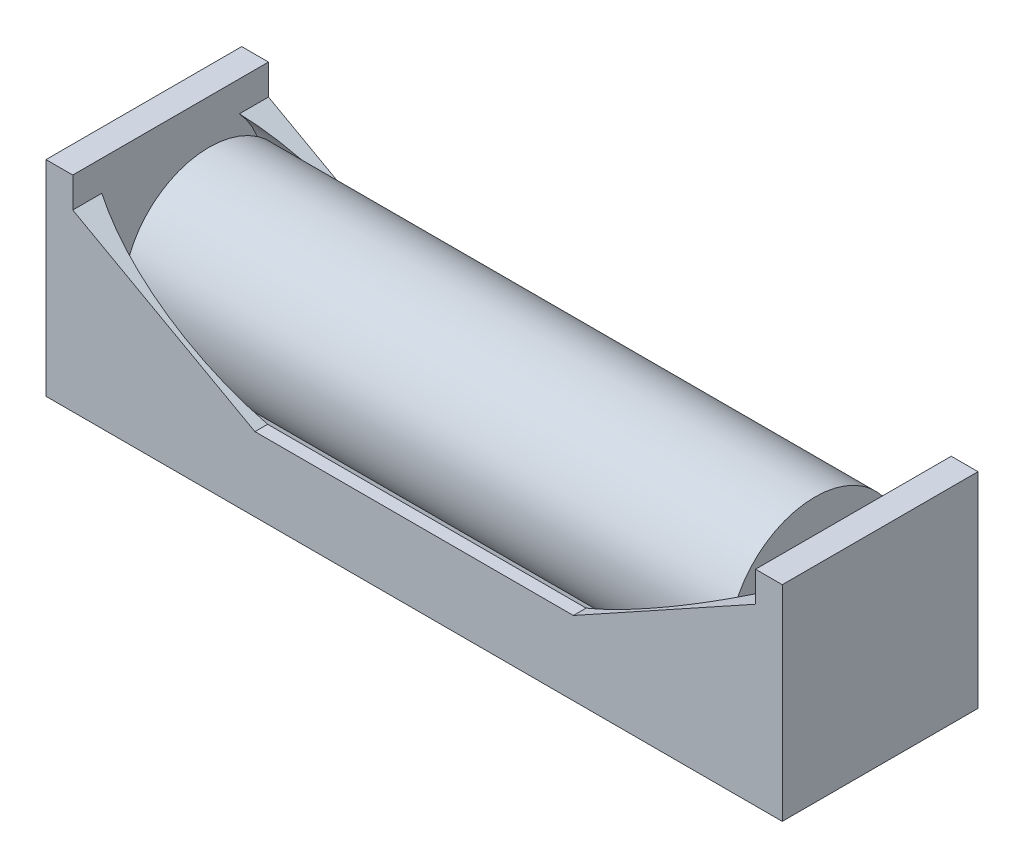
ISO-10303-21;
HEADER;
FILE_DESCRIPTION(('STEP AP214'),'2;1');
FILE_NAME('part.step','',(''),(''),'','','');
FILE_SCHEMA(('AUTOMOTIVE_DESIGN { 1 0 10303 214 1 1 1 1 }'));
ENDSEC;
DATA;
#1=APPLICATION_CONTEXT('core data for automotive mechanical design processes');
#2=APPLICATION_PROTOCOL_DEFINITION('international standard','automotive_design',2000,#1);
#3=PRODUCT_CONTEXT('',#1,'mechanical');
#4=PRODUCT('Part','Part','',(#3));
#5=PRODUCT_RELATED_PRODUCT_CATEGORY('part','',(#4));
#6=PRODUCT_DEFINITION_FORMATION('','',#4);
#7=PRODUCT_DEFINITION_CONTEXT('part definition',#1,'design');
#8=PRODUCT_DEFINITION('design','',#6,#7);
#9=PRODUCT_DEFINITION_SHAPE('','',#8);
#10=(LENGTH_UNIT() NAMED_UNIT(*) SI_UNIT(.MILLI.,.METRE.));
#11=(NAMED_UNIT(*) PLANE_ANGLE_UNIT() SI_UNIT($,.RADIAN.));
#12=(NAMED_UNIT(*) SI_UNIT($,.STERADIAN.) SOLID_ANGLE_UNIT());
#13=UNCERTAINTY_MEASURE_WITH_UNIT(LENGTH_MEASURE(1.E-05),#10,'distance_accuracy_value','');
#14=(GEOMETRIC_REPRESENTATION_CONTEXT(3) GLOBAL_UNCERTAINTY_ASSIGNED_CONTEXT((#13)) GLOBAL_UNIT_ASSIGNED_CONTEXT((#10,
#11,#12)) REPRESENTATION_CONTEXT('',''));
#15=CARTESIAN_POINT('',(0.,0.,0.));
#16=DIRECTION('',(0.,0.,1.));
#17=DIRECTION('',(1.,0.,0.));
#18=AXIS2_PLACEMENT_3D('',#15,#16,#17);
#19=CARTESIAN_POINT('',(-17.083580508812,4.9297339274579,-10.5));
#20=DIRECTION('',(3.17830590431947E-13,-1.,0.));
#21=DIRECTION('',(1.,3.17830590431947E-13,0.));
#22=AXIS2_PLACEMENT_3D('',#19,#20,#21);
#23=PLANE('',#22);
#24=DIRECTION('',(-1.,0.,0.));
#25=VECTOR('',#24,1.);
#26=CARTESIAN_POINT('',(64.913258277274,4.92973392748396,9.13416302125843));
#27=LINE('',#26,#25);
#28=CARTESIAN_POINT('',(-17.083580508812,4.92973392748396,9.13416302125843));
#29=VERTEX_POINT('',#28);
#30=CARTESIAN_POINT('',(17.083580508812,4.9297339274579,9.13416302124681));
#31=VERTEX_POINT('',#30);
#32=EDGE_CURVE('E148',#29,#31,#27,.F.);
#33=ORIENTED_EDGE('',*,*,#32,.F.);
#34=DIRECTION('',(0.,0.,1.));
#35=VECTOR('',#34,1.);
#36=CARTESIAN_POINT('',(-17.083580508812,4.9297339274579,-10.5));
#37=LINE('',#36,#35);
#38=CARTESIAN_POINT('',(-17.083580508812,4.9297339274579,10.5));
#39=VERTEX_POINT('',#38);
#40=EDGE_CURVE('E192',#29,#39,#37,.T.);
#41=ORIENTED_EDGE('',*,*,#40,.T.);
#42=DIRECTION('',(1.,3.17830590431947E-13,0.));
#43=VECTOR('',#42,1.);
#44=CARTESIAN_POINT('',(-17.083580508812,4.9297339274579,10.5));
#45=LINE('',#44,#43);
#46=CARTESIAN_POINT('',(17.083580508812,4.9297339274579,10.5));
#47=VERTEX_POINT('',#46);
#48=EDGE_CURVE('E175',#39,#47,#45,.T.);
#49=ORIENTED_EDGE('',*,*,#48,.T.);
#50=DIRECTION('',(0.,0.,1.));
#51=VECTOR('',#50,1.);
#52=CARTESIAN_POINT('',(17.083580508812,4.9297339274579,-10.5));
#53=LINE('',#52,#51);
#54=EDGE_CURVE('E172',#31,#47,#53,.T.);
#55=ORIENTED_EDGE('',*,*,#54,.F.);
#56=EDGE_LOOP('',(#33,#41,#49,#55));
#57=FACE_BOUND('',#56,.T.);
#58=ADVANCED_FACE('F45',(#57),#23,.F.);
#59=DIRECTION('',(-1.,0.,0.));
#60=VECTOR('',#59,1.);
#61=CARTESIAN_POINT('',(64.913258277274,4.92973392748396,-9.13416302125843));
#62=LINE('',#61,#60);
#63=CARTESIAN_POINT('',(17.083580508812,4.9297339274579,-9.13416302124683));
#64=VERTEX_POINT('',#63);
#65=CARTESIAN_POINT('',(-17.083580508812,4.92973392748396,-9.13416302125843));
#66=VERTEX_POINT('',#65);
#67=EDGE_CURVE('E279',#64,#66,#62,.T.);
#68=ORIENTED_EDGE('',*,*,#67,.F.);
#69=CARTESIAN_POINT('',(17.083580508812,4.9297339274579,-10.5));
#70=VERTEX_POINT('',#69);
#71=EDGE_CURVE('E159',#70,#64,#53,.T.);
#72=ORIENTED_EDGE('',*,*,#71,.F.);
#73=DIRECTION('',(1.,3.17830590431947E-13,0.));
#74=VECTOR('',#73,1.);
#75=CARTESIAN_POINT('',(-17.083580508812,4.9297339274579,-10.5));
#76=LINE('',#75,#74);
#77=CARTESIAN_POINT('',(-17.083580508812,4.9297339274579,-10.5));
#78=VERTEX_POINT('',#77);
#79=EDGE_CURVE('E178',#78,#70,#76,.T.);
#80=ORIENTED_EDGE('',*,*,#79,.F.);
#81=EDGE_CURVE('E188',#78,#66,#37,.T.);
#82=ORIENTED_EDGE('',*,*,#81,.T.);
#83=EDGE_LOOP('',(#68,#72,#80,#82));
#84=FACE_BOUND('',#83,.T.);
#85=ADVANCED_FACE('F278',(#84),#23,.F.);
#86=CARTESIAN_POINT('',(-36.6289870298108,15.7468482234305,-10.5));
#87=DIRECTION('',(-0.484224588764029,-0.874943739697763,0.));
#88=DIRECTION('',(0.874943739697763,-0.484224588764029,0.));
#89=AXIS2_PLACEMENT_3D('',#86,#87,#88);
#90=PLANE('',#89);
#91=CARTESIAN_POINT('',(-24.4381302398881,9.,0.));
#92=DIRECTION('',(-0.484224588764029,-0.874943739697763,0.));
#93=DIRECTION('',(-0.874943739697763,0.484224588764029,0.));
#94=AXIS2_PLACEMENT_3D('',#91,#92,#93);
#95=ELLIPSE('',#94,20.6515741497654,10.);
#96=CARTESIAN_POINT('',(-36.6289870298108,15.7468482234305,7.38105948018252));
#97=VERTEX_POINT('',#96);
#98=EDGE_CURVE('E280',#97,#29,#95,.F.);
#99=ORIENTED_EDGE('',*,*,#98,.F.);
#100=DIRECTION('',(0.,0.,1.));
#101=VECTOR('',#100,1.);
#102=CARTESIAN_POINT('',(-36.6289870298108,15.7468482234305,-10.5));
#103=LINE('',#102,#101);
#104=CARTESIAN_POINT('',(-36.6289870298108,15.7468482234305,10.5));
#105=VERTEX_POINT('',#104);
#106=EDGE_CURVE('E196',#97,#105,#103,.T.);
#107=ORIENTED_EDGE('',*,*,#106,.T.);
#108=DIRECTION('',(0.874943739697763,-0.484224588764029,0.));
#109=VECTOR('',#108,1.);
#110=CARTESIAN_POINT('',(-36.6289870298108,15.7468482234305,10.5));
#111=LINE('',#110,#109);
#112=EDGE_CURVE('E183',#105,#39,#111,.T.);
#113=ORIENTED_EDGE('',*,*,#112,.T.);
#114=ORIENTED_EDGE('',*,*,#40,.F.);
#115=EDGE_LOOP('',(#99,#107,#113,#114));
#116=FACE_BOUND('',#115,.T.);
#117=ADVANCED_FACE('F289',(#116),#90,.F.);
#118=CARTESIAN_POINT('',(36.6289870298108,15.7468482234305,-10.5));
#119=DIRECTION('',(-0.484224588764029,0.874943739697763,0.));
#120=DIRECTION('',(-0.874943739697763,-0.484224588764029,0.));
#121=AXIS2_PLACEMENT_3D('',#118,#119,#120);
#122=PLANE('',#121);
#123=ORIENTED_EDGE('',*,*,#71,.T.);
#124=CARTESIAN_POINT('',(24.438130239888,9.,0.));
#125=DIRECTION('',(-0.484224588764029,0.874943739697763,0.));
#126=DIRECTION('',(-0.874943739697763,-0.484224588764029,0.));
#127=AXIS2_PLACEMENT_3D('',#124,#125,#126);
#128=ELLIPSE('',#127,20.6515741497654,10.);
#129=CARTESIAN_POINT('',(36.6289870298108,15.7468482234305,-7.38105948018252));
#130=VERTEX_POINT('',#129);
#131=EDGE_CURVE('E12',#64,#130,#128,.F.);
#132=ORIENTED_EDGE('',*,*,#131,.T.);
#133=DIRECTION('',(0.,0.,1.));
#134=VECTOR('',#133,1.);
#135=CARTESIAN_POINT('',(36.6289870298108,15.7468482234305,-10.5));
#136=LINE('',#135,#134);
#137=CARTESIAN_POINT('',(36.6289870298108,15.7468482234305,-10.5));
#138=VERTEX_POINT('',#137);
#139=EDGE_CURVE('E156',#138,#130,#136,.T.);
#140=ORIENTED_EDGE('',*,*,#139,.F.);
#141=DIRECTION('',(-0.874943739697763,-0.484224588764029,0.));
#142=VECTOR('',#141,1.);
#143=CARTESIAN_POINT('',(36.6289870298108,15.7468482234305,-10.5));
#144=LINE('',#143,#142);
#145=EDGE_CURVE('E240',#138,#70,#144,.T.);
#146=ORIENTED_EDGE('',*,*,#145,.T.);
#147=EDGE_LOOP('',(#123,#132,#140,#146));
#148=FACE_BOUND('',#147,.T.);
#149=ADVANCED_FACE('F154',(#148),#122,.T.);
#150=CARTESIAN_POINT('',(36.6289870298108,15.7468482234305,7.38105948018252));
#151=VERTEX_POINT('',#150);
#152=CARTESIAN_POINT('',(36.6289870298108,15.7468482234305,10.5));
#153=VERTEX_POINT('',#152);
#154=EDGE_CURVE('E165',#151,#153,#136,.T.);
#155=ORIENTED_EDGE('',*,*,#154,.F.);
#156=EDGE_CURVE('E49',#151,#31,#128,.F.);
#157=ORIENTED_EDGE('',*,*,#156,.T.);
#158=ORIENTED_EDGE('',*,*,#54,.T.);
#159=DIRECTION('',(-0.874943739697763,-0.484224588764029,0.));
#160=VECTOR('',#159,1.);
#161=CARTESIAN_POINT('',(36.6289870298108,15.7468482234305,10.5));
#162=LINE('',#161,#160);
#163=EDGE_CURVE('E246',#153,#47,#162,.T.);
#164=ORIENTED_EDGE('',*,*,#163,.F.);
#165=EDGE_LOOP('',(#155,#157,#158,#164));
#166=FACE_BOUND('',#165,.T.);
#167=ADVANCED_FACE('F233',(#166),#122,.T.);
#168=CARTESIAN_POINT('',(0.,19.,0.));
#169=DIRECTION('',(0.,-1.,0.));
#170=DIRECTION('',(0.,0.,-1.));
#171=AXIS2_PLACEMENT_3D('',#168,#169,#170);
#172=PLANE('',#171);
#173=DIRECTION('',(0.,0.,1.));
#174=VECTOR('',#173,1.);
#175=CARTESIAN_POINT('',(36.6289870298108,19.,-10.5));
#176=LINE('',#175,#174);
#177=CARTESIAN_POINT('',(36.6289870298108,19.,-10.5));
#178=VERTEX_POINT('',#177);
#179=CARTESIAN_POINT('',(36.6289870298108,19.,10.5));
#180=VERTEX_POINT('',#179);
#181=EDGE_CURVE('E164',#178,#180,#176,.T.);
#182=ORIENTED_EDGE('',*,*,#181,.T.);
#183=DIRECTION('',(1.,0.,0.));
#184=VECTOR('',#183,1.);
#185=CARTESIAN_POINT('',(-39.5,19.,10.5));
#186=LINE('',#185,#184);
#187=CARTESIAN_POINT('',(39.5,19.,10.5));
#188=VERTEX_POINT('',#187);
#189=EDGE_CURVE('E208',#180,#188,#186,.T.);
#190=ORIENTED_EDGE('',*,*,#189,.T.);
#191=DIRECTION('',(0.,0.,-1.));
#192=VECTOR('',#191,1.);
#193=CARTESIAN_POINT('',(39.5,19.,10.5));
#194=LINE('',#193,#192);
#195=CARTESIAN_POINT('',(39.5,19.,-10.5));
#196=VERTEX_POINT('',#195);
#197=EDGE_CURVE('E198',#188,#196,#194,.T.);
#198=ORIENTED_EDGE('',*,*,#197,.T.);
#199=DIRECTION('',(-1.,0.,0.));
#200=VECTOR('',#199,1.);
#201=CARTESIAN_POINT('',(-39.5,19.,-10.5));
#202=LINE('',#201,#200);
#203=EDGE_CURVE('E203',#196,#178,#202,.T.);
#204=ORIENTED_EDGE('',*,*,#203,.T.);
#205=EDGE_LOOP('',(#182,#190,#198,#204));
#206=FACE_BOUND('',#205,.T.);
#207=ADVANCED_FACE('F255',(#206),#172,.F.);
#208=CARTESIAN_POINT('',(-39.5,19.,-10.5));
#209=DIRECTION('',(0.,0.,1.));
#210=DIRECTION('',(1.,0.,0.));
#211=AXIS2_PLACEMENT_3D('',#208,#209,#210);
#212=PLANE('',#211);
#213=DIRECTION('',(0.,-1.,0.));
#214=VECTOR('',#213,1.);
#215=CARTESIAN_POINT('',(36.6289870298108,19.,-10.5));
#216=LINE('',#215,#214);
#217=EDGE_CURVE('E163',#178,#138,#216,.T.);
#218=ORIENTED_EDGE('',*,*,#217,.F.);
#219=ORIENTED_EDGE('',*,*,#203,.F.);
#220=DIRECTION('',(0.,-1.,0.));
#221=VECTOR('',#220,1.);
#222=CARTESIAN_POINT('',(39.5,19.,-10.5));
#223=LINE('',#222,#221);
#224=CARTESIAN_POINT('',(39.5,-3.,-10.5));
#225=VERTEX_POINT('',#224);
#226=EDGE_CURVE('E227',#196,#225,#223,.T.);
#227=ORIENTED_EDGE('',*,*,#226,.T.);
#228=DIRECTION('',(-1.,0.,0.));
#229=VECTOR('',#228,1.);
#230=CARTESIAN_POINT('',(-39.5,-3.,-10.5));
#231=LINE('',#230,#229);
#232=CARTESIAN_POINT('',(-39.5,-3.,-10.5));
#233=VERTEX_POINT('',#232);
#234=EDGE_CURVE('E215',#225,#233,#231,.T.);
#235=ORIENTED_EDGE('',*,*,#234,.T.);
#236=DIRECTION('',(0.,-1.,0.));
#237=VECTOR('',#236,1.);
#238=CARTESIAN_POINT('',(-39.5,19.,-10.5));
#239=LINE('',#238,#237);
#240=CARTESIAN_POINT('',(-39.5,19.,-10.5));
#241=VERTEX_POINT('',#240);
#242=EDGE_CURVE('E225',#241,#233,#239,.T.);
#243=ORIENTED_EDGE('',*,*,#242,.F.);
#244=CARTESIAN_POINT('',(-36.6289870298108,19.,-10.5));
#245=VERTEX_POINT('',#244);
#246=EDGE_CURVE('E201',#245,#241,#202,.T.);
#247=ORIENTED_EDGE('',*,*,#246,.F.);
#248=DIRECTION('',(0.,-1.,0.));
#249=VECTOR('',#248,1.);
#250=CARTESIAN_POINT('',(-36.6289870298108,19.,-10.5));
#251=LINE('',#250,#249);
#252=CARTESIAN_POINT('',(-36.6289870298108,15.7468482234305,-10.5));
#253=VERTEX_POINT('',#252);
#254=EDGE_CURVE('E68',#245,#253,#251,.T.);
#255=ORIENTED_EDGE('',*,*,#254,.T.);
#256=DIRECTION('',(0.874943739697763,-0.484224588764029,0.));
#257=VECTOR('',#256,1.);
#258=CARTESIAN_POINT('',(-36.6289870298108,15.7468482234305,-10.5));
#259=LINE('',#258,#257);
#260=EDGE_CURVE('E174',#253,#78,#259,.T.);
#261=ORIENTED_EDGE('',*,*,#260,.T.);
#262=ORIENTED_EDGE('',*,*,#79,.T.);
#263=ORIENTED_EDGE('',*,*,#145,.F.);
#264=EDGE_LOOP('',(#218,#219,#227,#235,#243,#247,#255,#261,#262,#263));
#265=FACE_BOUND('',#264,.T.);
#266=ADVANCED_FACE('F254',(#265),#212,.F.);
#267=CARTESIAN_POINT('',(-39.5,19.,10.5));
#268=DIRECTION('',(0.,0.,-1.));
#269=DIRECTION('',(-1.,0.,0.));
#270=AXIS2_PLACEMENT_3D('',#267,#268,#269);
#271=PLANE('',#270);
#272=DIRECTION('',(0.,-1.,0.));
#273=VECTOR('',#272,1.);
#274=CARTESIAN_POINT('',(36.6289870298108,19.,10.5));
#275=LINE('',#274,#273);
#276=EDGE_CURVE('E242',#180,#153,#275,.T.);
#277=ORIENTED_EDGE('',*,*,#276,.T.);
#278=ORIENTED_EDGE('',*,*,#163,.T.);
#279=ORIENTED_EDGE('',*,*,#48,.F.);
#280=ORIENTED_EDGE('',*,*,#112,.F.);
#281=DIRECTION('',(0.,-1.,0.));
#282=VECTOR('',#281,1.);
#283=CARTESIAN_POINT('',(-36.6289870298108,19.,10.5));
#284=LINE('',#283,#282);
#285=CARTESIAN_POINT('',(-36.6289870298108,19.,10.5));
#286=VERTEX_POINT('',#285);
#287=EDGE_CURVE('E167',#286,#105,#284,.T.);
#288=ORIENTED_EDGE('',*,*,#287,.F.);
#289=CARTESIAN_POINT('',(-39.5,19.,10.5));
#290=VERTEX_POINT('',#289);
#291=EDGE_CURVE('E209',#290,#286,#186,.T.);
#292=ORIENTED_EDGE('',*,*,#291,.F.);
#293=DIRECTION('',(0.,-1.,0.));
#294=VECTOR('',#293,1.);
#295=CARTESIAN_POINT('',(-39.5,19.,10.5));
#296=LINE('',#295,#294);
#297=CARTESIAN_POINT('',(-39.5,-3.,10.5));
#298=VERTEX_POINT('',#297);
#299=EDGE_CURVE('E222',#290,#298,#296,.T.);
#300=ORIENTED_EDGE('',*,*,#299,.T.);
#301=DIRECTION('',(1.,0.,0.));
#302=VECTOR('',#301,1.);
#303=CARTESIAN_POINT('',(-39.5,-3.,10.5));
#304=LINE('',#303,#302);
#305=CARTESIAN_POINT('',(39.5,-3.,10.5));
#306=VERTEX_POINT('',#305);
#307=EDGE_CURVE('E202',#298,#306,#304,.T.);
#308=ORIENTED_EDGE('',*,*,#307,.T.);
#309=DIRECTION('',(0.,-1.,0.));
#310=VECTOR('',#309,1.);
#311=CARTESIAN_POINT('',(39.5,19.,10.5));
#312=LINE('',#311,#310);
#313=EDGE_CURVE('E212',#188,#306,#312,.T.);
#314=ORIENTED_EDGE('',*,*,#313,.F.);
#315=ORIENTED_EDGE('',*,*,#189,.F.);
#316=EDGE_LOOP('',(#277,#278,#279,#280,#288,#292,#300,#308,#314,#315));
#317=FACE_BOUND('',#316,.T.);
#318=ADVANCED_FACE('F251',(#317),#271,.F.);
#319=CARTESIAN_POINT('',(39.5,19.,10.5));
#320=DIRECTION('',(-1.,0.,0.));
#321=DIRECTION('',(0.,0.,1.));
#322=AXIS2_PLACEMENT_3D('',#319,#320,#321);
#323=PLANE('',#322);
#324=DIRECTION('',(0.,0.,-1.));
#325=VECTOR('',#324,1.);
#326=CARTESIAN_POINT('',(39.5,-3.,10.5));
#327=LINE('',#326,#325);
#328=EDGE_CURVE('E191',#306,#225,#327,.T.);
#329=ORIENTED_EDGE('',*,*,#328,.T.);
#330=ORIENTED_EDGE('',*,*,#226,.F.);
#331=ORIENTED_EDGE('',*,*,#197,.F.);
#332=ORIENTED_EDGE('',*,*,#313,.T.);
#333=EDGE_LOOP('',(#329,#330,#331,#332));
#334=FACE_BOUND('',#333,.T.);
#335=ADVANCED_FACE('F47',(#334),#323,.F.);
#336=CARTESIAN_POINT('',(-39.5,19.,10.5));
#337=DIRECTION('',(1.,0.,0.));
#338=DIRECTION('',(0.,0.,-1.));
#339=AXIS2_PLACEMENT_3D('',#336,#337,#338);
#340=PLANE('',#339);
#341=DIRECTION('',(0.,0.,1.));
#342=VECTOR('',#341,1.);
#343=CARTESIAN_POINT('',(-39.5,-3.,10.5));
#344=LINE('',#343,#342);
#345=EDGE_CURVE('E217',#233,#298,#344,.T.);
#346=ORIENTED_EDGE('',*,*,#345,.T.);
#347=ORIENTED_EDGE('',*,*,#299,.F.);
#348=DIRECTION('',(0.,0.,1.));
#349=VECTOR('',#348,1.);
#350=CARTESIAN_POINT('',(-39.5,19.,10.5));
#351=LINE('',#350,#349);
#352=EDGE_CURVE('E206',#241,#290,#351,.T.);
#353=ORIENTED_EDGE('',*,*,#352,.F.);
#354=ORIENTED_EDGE('',*,*,#242,.T.);
#355=EDGE_LOOP('',(#346,#347,#353,#354));
#356=FACE_BOUND('',#355,.T.);
#357=ADVANCED_FACE('F267',(#356),#340,.F.);
#358=ORIENTED_EDGE('',*,*,#291,.T.);
#359=DIRECTION('',(0.,0.,1.));
#360=VECTOR('',#359,1.);
#361=CARTESIAN_POINT('',(-36.6289870298108,19.,-10.5));
#362=LINE('',#361,#360);
#363=EDGE_CURVE('E180',#245,#286,#362,.T.);
#364=ORIENTED_EDGE('',*,*,#363,.F.);
#365=ORIENTED_EDGE('',*,*,#246,.T.);
#366=ORIENTED_EDGE('',*,*,#352,.T.);
#367=EDGE_LOOP('',(#358,#364,#365,#366));
#368=FACE_BOUND('',#367,.T.);
#369=ADVANCED_FACE('F271',(#368),#172,.F.);
#370=CARTESIAN_POINT('',(0.,-3.,0.));
#371=DIRECTION('',(0.,-1.,0.));
#372=DIRECTION('',(0.,0.,-1.));
#373=AXIS2_PLACEMENT_3D('',#370,#371,#372);
#374=PLANE('',#373);
#375=ORIENTED_EDGE('',*,*,#328,.F.);
#376=ORIENTED_EDGE('',*,*,#307,.F.);
#377=ORIENTED_EDGE('',*,*,#345,.F.);
#378=ORIENTED_EDGE('',*,*,#234,.F.);
#379=EDGE_LOOP('',(#375,#376,#377,#378));
#380=FACE_BOUND('',#379,.T.);
#381=ADVANCED_FACE('F261',(#380),#374,.T.);
#382=CARTESIAN_POINT('',(-36.6289870298108,15.7468482234305,-7.38105948018252));
#383=VERTEX_POINT('',#382);
#384=EDGE_CURVE('E247',#66,#383,#95,.F.);
#385=ORIENTED_EDGE('',*,*,#384,.F.);
#386=ORIENTED_EDGE('',*,*,#81,.F.);
#387=ORIENTED_EDGE('',*,*,#260,.F.);
#388=EDGE_CURVE('E193',#253,#383,#103,.T.);
#389=ORIENTED_EDGE('',*,*,#388,.T.);
#390=EDGE_LOOP('',(#385,#386,#387,#389));
#391=FACE_BOUND('',#390,.T.);
#392=ADVANCED_FACE('F276',(#391),#90,.F.);
#393=CARTESIAN_POINT('',(-36.6289870298108,19.,-10.5));
#394=DIRECTION('',(-1.,0.,0.));
#395=DIRECTION('',(0.,0.,1.));
#396=AXIS2_PLACEMENT_3D('',#393,#394,#395);
#397=PLANE('',#396);
#398=ORIENTED_EDGE('',*,*,#106,.F.);
#399=CARTESIAN_POINT('',(-36.6289870298108,9.,0.));
#400=DIRECTION('',(1.,0.,0.));
#401=DIRECTION('',(0.,0.,-1.));
#402=AXIS2_PLACEMENT_3D('',#399,#400,#401);
#403=CIRCLE('',#402,10.);
#404=EDGE_CURVE('E149',#97,#383,#403,.T.);
#405=ORIENTED_EDGE('',*,*,#404,.T.);
#406=ORIENTED_EDGE('',*,*,#388,.F.);
#407=ORIENTED_EDGE('',*,*,#254,.F.);
#408=ORIENTED_EDGE('',*,*,#363,.T.);
#409=ORIENTED_EDGE('',*,*,#287,.T.);
#410=EDGE_LOOP('',(#398,#405,#406,#407,#408,#409));
#411=FACE_BOUND('',#410,.T.);
#412=ADVANCED_FACE('F286',(#411),#397,.F.);
#413=CARTESIAN_POINT('',(36.6289870298108,19.,-10.5));
#414=DIRECTION('',(-1.,0.,0.));
#415=DIRECTION('',(0.,0.,1.));
#416=AXIS2_PLACEMENT_3D('',#413,#414,#415);
#417=PLANE('',#416);
#418=ORIENTED_EDGE('',*,*,#276,.F.);
#419=ORIENTED_EDGE('',*,*,#181,.F.);
#420=ORIENTED_EDGE('',*,*,#217,.T.);
#421=ORIENTED_EDGE('',*,*,#139,.T.);
#422=CARTESIAN_POINT('',(36.6289870298108,9.,0.));
#423=DIRECTION('',(-1.,0.,0.));
#424=DIRECTION('',(0.,0.,1.));
#425=AXIS2_PLACEMENT_3D('',#422,#423,#424);
#426=CIRCLE('',#425,10.);
#427=EDGE_CURVE('E60',#130,#151,#426,.T.);
#428=ORIENTED_EDGE('',*,*,#427,.T.);
#429=ORIENTED_EDGE('',*,*,#154,.T.);
#430=EDGE_LOOP('',(#418,#419,#420,#421,#428,#429));
#431=FACE_BOUND('',#430,.T.);
#432=ADVANCED_FACE('F161',(#431),#417,.T.);
#433=CARTESIAN_POINT('',(64.9132582772727,9.,0.));
#434=DIRECTION('',(-1.,0.,0.));
#435=DIRECTION('',(0.,0.,1.));
#436=AXIS2_PLACEMENT_3D('',#433,#434,#435);
#437=CYLINDRICAL_SURFACE('',#436,10.);
#438=ORIENTED_EDGE('',*,*,#384,.T.);
#439=ORIENTED_EDGE('',*,*,#404,.F.);
#440=ORIENTED_EDGE('',*,*,#98,.T.);
#441=ORIENTED_EDGE('',*,*,#32,.T.);
#442=ORIENTED_EDGE('',*,*,#156,.F.);
#443=ORIENTED_EDGE('',*,*,#427,.F.);
#444=ORIENTED_EDGE('',*,*,#131,.F.);
#445=ORIENTED_EDGE('',*,*,#67,.T.);
#446=EDGE_LOOP('',(#438,#439,#440,#441,#442,#443,#444,#445));
#447=FACE_BOUND('',#446,.T.);
#448=ADVANCED_FACE('F144',(#447),#437,.F.);
#449=CLOSED_SHELL('',(#58,#85,#117,#149,#167,#207,#266,#318,#335,#357,#369,#381,#392,#412,#432,#448));
#450=MANIFOLD_SOLID_BREP('B2',#449);
#451=CARTESIAN_POINT('',(-32.5,9.2,0.));
#452=DIRECTION('',(1.,0.,0.));
#453=DIRECTION('',(0.,0.,-1.));
#454=AXIS2_PLACEMENT_3D('',#451,#452,#453);
#455=CYLINDRICAL_SURFACE('',#454,9.2);
#456=CARTESIAN_POINT('',(-32.5,9.2,0.));
#457=DIRECTION('',(1.,0.,0.));
#458=DIRECTION('',(0.,0.,-1.));
#459=AXIS2_PLACEMENT_3D('',#456,#457,#458);
#460=CIRCLE('',#459,9.2);
#461=CARTESIAN_POINT('',(-32.5,9.2,-9.2));
#462=VERTEX_POINT('',#461);
#463=EDGE_CURVE('E44',#462,#462,#460,.T.);
#464=ORIENTED_EDGE('',*,*,#463,.T.);
#465=EDGE_LOOP('',(#464));
#466=FACE_BOUND('',#465,.T.);
#467=CARTESIAN_POINT('',(32.5,9.2,0.));
#468=DIRECTION('',(1.,0.,0.));
#469=DIRECTION('',(0.,0.,-1.));
#470=AXIS2_PLACEMENT_3D('',#467,#468,#469);
#471=CIRCLE('',#470,9.2);
#472=CARTESIAN_POINT('',(32.5,9.2,-9.2));
#473=VERTEX_POINT('',#472);
#474=EDGE_CURVE('E435',#473,#473,#471,.T.);
#475=ORIENTED_EDGE('',*,*,#474,.F.);
#476=EDGE_LOOP('',(#475));
#477=FACE_BOUND('',#476,.T.);
#478=ADVANCED_FACE('F429',(#466,#477),#455,.T.);
#479=CARTESIAN_POINT('',(-32.5,9.2,0.));
#480=DIRECTION('',(1.,0.,0.));
#481=DIRECTION('',(0.,0.,-1.));
#482=AXIS2_PLACEMENT_3D('',#479,#480,#481);
#483=PLANE('',#482);
#484=ORIENTED_EDGE('',*,*,#463,.F.);
#485=EDGE_LOOP('',(#484));
#486=FACE_BOUND('',#485,.T.);
#487=ADVANCED_FACE('F444',(#486),#483,.F.);
#488=CARTESIAN_POINT('',(32.5,9.2,0.));
#489=DIRECTION('',(1.,0.,0.));
#490=DIRECTION('',(0.,0.,-1.));
#491=AXIS2_PLACEMENT_3D('',#488,#489,#490);
#492=PLANE('',#491);
#493=ORIENTED_EDGE('',*,*,#474,.T.);
#494=EDGE_LOOP('',(#493));
#495=FACE_BOUND('',#494,.T.);
#496=ADVANCED_FACE('F441',(#495),#492,.T.);
#497=CLOSED_SHELL('',(#478,#487,#496));
#498=MANIFOLD_SOLID_BREP('B6',#497);
#499=ADVANCED_BREP_SHAPE_REPRESENTATION('',(#18,#450,#498),#14);
#500=SHAPE_DEFINITION_REPRESENTATION(#9,#499);
ENDSEC;
END-ISO-10303-21;
